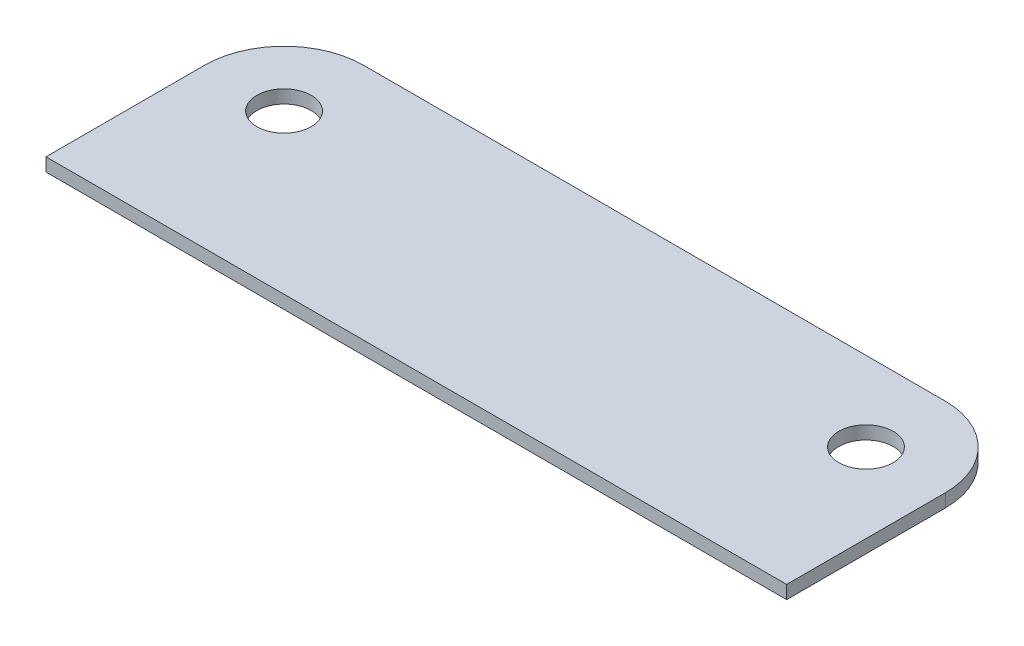
ISO-10303-21;
HEADER;
FILE_DESCRIPTION(('STEP AP214'),'2;1');
FILE_NAME('part.step','',(''),(''),'','','');
FILE_SCHEMA(('AUTOMOTIVE_DESIGN { 1 0 10303 214 1 1 1 1 }'));
ENDSEC;
DATA;
#1=APPLICATION_CONTEXT('core data for automotive mechanical design processes');
#2=APPLICATION_PROTOCOL_DEFINITION('international standard','automotive_design',2000,#1);
#3=PRODUCT_CONTEXT('',#1,'mechanical');
#4=PRODUCT('Part','Part','',(#3));
#5=PRODUCT_RELATED_PRODUCT_CATEGORY('part','',(#4));
#6=PRODUCT_DEFINITION_FORMATION('','',#4);
#7=PRODUCT_DEFINITION_CONTEXT('part definition',#1,'design');
#8=PRODUCT_DEFINITION('design','',#6,#7);
#9=PRODUCT_DEFINITION_SHAPE('','',#8);
#10=(LENGTH_UNIT() NAMED_UNIT(*) SI_UNIT(.MILLI.,.METRE.));
#11=(NAMED_UNIT(*) PLANE_ANGLE_UNIT() SI_UNIT($,.RADIAN.));
#12=(NAMED_UNIT(*) SI_UNIT($,.STERADIAN.) SOLID_ANGLE_UNIT());
#13=UNCERTAINTY_MEASURE_WITH_UNIT(LENGTH_MEASURE(1.E-05),#10,'distance_accuracy_value','');
#14=(GEOMETRIC_REPRESENTATION_CONTEXT(3) GLOBAL_UNCERTAINTY_ASSIGNED_CONTEXT((#13)) GLOBAL_UNIT_ASSIGNED_CONTEXT((#10,
#11,#12)) REPRESENTATION_CONTEXT('',''));
#15=CARTESIAN_POINT('',(0.,0.,0.));
#16=DIRECTION('',(0.,0.,1.));
#17=DIRECTION('',(1.,0.,0.));
#18=AXIS2_PLACEMENT_3D('',#15,#16,#17);
#19=CARTESIAN_POINT('',(34.925,1.5875,-19.05));
#20=DIRECTION('',(0.,1.,0.));
#21=DIRECTION('',(0.,0.,1.));
#22=AXIS2_PLACEMENT_3D('',#19,#20,#21);
#23=PLANE('',#22);
#24=CARTESIAN_POINT('',(-34.925,1.5875,-19.05));
#25=DIRECTION('',(0.,1.,0.));
#26=DIRECTION('',(0.,0.,1.));
#27=AXIS2_PLACEMENT_3D('',#24,#25,#26);
#28=CIRCLE('',#27,3.26390000000007);
#29=CARTESIAN_POINT('',(-34.925,1.5875,-15.7860999999999));
#30=VERTEX_POINT('',#29);
#31=EDGE_CURVE('E128',#30,#30,#28,.T.);
#32=ORIENTED_EDGE('',*,*,#31,.F.);
#33=EDGE_LOOP('',(#32));
#34=FACE_BOUND('',#33,.T.);
#35=DIRECTION('',(0.,0.,-1.));
#36=VECTOR('',#35,1.);
#37=CARTESIAN_POINT('',(44.45,1.5875,0.));
#38=LINE('',#37,#36);
#39=CARTESIAN_POINT('',(44.45,1.5875,0.));
#40=VERTEX_POINT('',#39);
#41=CARTESIAN_POINT('',(44.45,1.5875,-19.05));
#42=VERTEX_POINT('',#41);
#43=EDGE_CURVE('E135',#40,#42,#38,.T.);
#44=ORIENTED_EDGE('',*,*,#43,.T.);
#45=CARTESIAN_POINT('',(34.925,1.5875,-19.05));
#46=DIRECTION('',(0.,1.,0.));
#47=DIRECTION('',(0.,0.,1.));
#48=AXIS2_PLACEMENT_3D('',#45,#46,#47);
#49=CIRCLE('',#48,9.525);
#50=CARTESIAN_POINT('',(34.925,1.5875,-28.575));
#51=VERTEX_POINT('',#50);
#52=EDGE_CURVE('E93',#42,#51,#49,.T.);
#53=ORIENTED_EDGE('',*,*,#52,.T.);
#54=DIRECTION('',(-1.,0.,0.));
#55=VECTOR('',#54,1.);
#56=CARTESIAN_POINT('',(-34.925,1.5875,-28.575));
#57=LINE('',#56,#55);
#58=CARTESIAN_POINT('',(-34.925,1.5875,-28.575));
#59=VERTEX_POINT('',#58);
#60=EDGE_CURVE('E106',#51,#59,#57,.T.);
#61=ORIENTED_EDGE('',*,*,#60,.T.);
#62=CARTESIAN_POINT('',(-34.925,1.5875,-19.05));
#63=DIRECTION('',(0.,1.,0.));
#64=DIRECTION('',(0.,0.,1.));
#65=AXIS2_PLACEMENT_3D('',#62,#63,#64);
#66=CIRCLE('',#65,9.525);
#67=CARTESIAN_POINT('',(-44.45,1.5875,-19.05));
#68=VERTEX_POINT('',#67);
#69=EDGE_CURVE('E100',#59,#68,#66,.T.);
#70=ORIENTED_EDGE('',*,*,#69,.T.);
#71=DIRECTION('',(0.,0.,1.));
#72=VECTOR('',#71,1.);
#73=CARTESIAN_POINT('',(-44.45,1.5875,-19.05));
#74=LINE('',#73,#72);
#75=CARTESIAN_POINT('',(-44.45,1.5875,0.));
#76=VERTEX_POINT('',#75);
#77=EDGE_CURVE('E104',#68,#76,#74,.T.);
#78=ORIENTED_EDGE('',*,*,#77,.T.);
#79=DIRECTION('',(1.,0.,0.));
#80=VECTOR('',#79,1.);
#81=CARTESIAN_POINT('',(-44.45,1.5875,0.));
#82=LINE('',#81,#80);
#83=EDGE_CURVE('E56',#76,#40,#82,.T.);
#84=ORIENTED_EDGE('',*,*,#83,.T.);
#85=EDGE_LOOP('',(#44,#53,#61,#70,#78,#84));
#86=FACE_BOUND('',#85,.T.);
#87=CARTESIAN_POINT('',(34.925,1.5875,-19.05));
#88=DIRECTION('',(0.,1.,0.));
#89=DIRECTION('',(0.,0.,1.));
#90=AXIS2_PLACEMENT_3D('',#87,#88,#89);
#91=CIRCLE('',#90,3.26390000000003);
#92=CARTESIAN_POINT('',(34.925,1.5875,-15.7861));
#93=VERTEX_POINT('',#92);
#94=EDGE_CURVE('E177',#93,#93,#91,.T.);
#95=ORIENTED_EDGE('',*,*,#94,.F.);
#96=EDGE_LOOP('',(#95));
#97=FACE_BOUND('',#96,.T.);
#98=ADVANCED_FACE('F39',(#34,#86,#97),#23,.T.);
#99=CARTESIAN_POINT('',(34.925,0.,-19.05));
#100=DIRECTION('',(0.,1.,0.));
#101=DIRECTION('',(0.,0.,1.));
#102=AXIS2_PLACEMENT_3D('',#99,#100,#101);
#103=PLANE('',#102);
#104=DIRECTION('',(0.,0.,-1.));
#105=VECTOR('',#104,1.);
#106=CARTESIAN_POINT('',(44.45,0.,0.));
#107=LINE('',#106,#105);
#108=CARTESIAN_POINT('',(44.45,0.,0.));
#109=VERTEX_POINT('',#108);
#110=CARTESIAN_POINT('',(44.45,0.,-19.05));
#111=VERTEX_POINT('',#110);
#112=EDGE_CURVE('E124',#109,#111,#107,.T.);
#113=ORIENTED_EDGE('',*,*,#112,.F.);
#114=DIRECTION('',(1.,0.,0.));
#115=VECTOR('',#114,1.);
#116=CARTESIAN_POINT('',(-44.45,0.,0.));
#117=LINE('',#116,#115);
#118=CARTESIAN_POINT('',(-44.45,0.,0.));
#119=VERTEX_POINT('',#118);
#120=EDGE_CURVE('E85',#119,#109,#117,.T.);
#121=ORIENTED_EDGE('',*,*,#120,.F.);
#122=DIRECTION('',(0.,0.,1.));
#123=VECTOR('',#122,1.);
#124=CARTESIAN_POINT('',(-44.45,0.,-19.05));
#125=LINE('',#124,#123);
#126=CARTESIAN_POINT('',(-44.45,0.,-19.05));
#127=VERTEX_POINT('',#126);
#128=EDGE_CURVE('E79',#127,#119,#125,.T.);
#129=ORIENTED_EDGE('',*,*,#128,.F.);
#130=CARTESIAN_POINT('',(-34.925,0.,-19.05));
#131=DIRECTION('',(0.,1.,0.));
#132=DIRECTION('',(0.,0.,1.));
#133=AXIS2_PLACEMENT_3D('',#130,#131,#132);
#134=CIRCLE('',#133,9.525);
#135=CARTESIAN_POINT('',(-34.925,0.,-28.575));
#136=VERTEX_POINT('',#135);
#137=EDGE_CURVE('E114',#136,#127,#134,.T.);
#138=ORIENTED_EDGE('',*,*,#137,.F.);
#139=DIRECTION('',(-1.,0.,0.));
#140=VECTOR('',#139,1.);
#141=CARTESIAN_POINT('',(-34.925,0.,-28.575));
#142=LINE('',#141,#140);
#143=CARTESIAN_POINT('',(34.925,0.,-28.575));
#144=VERTEX_POINT('',#143);
#145=EDGE_CURVE('E130',#144,#136,#142,.T.);
#146=ORIENTED_EDGE('',*,*,#145,.F.);
#147=CARTESIAN_POINT('',(34.925,0.,-19.05));
#148=DIRECTION('',(0.,1.,0.));
#149=DIRECTION('',(0.,0.,1.));
#150=AXIS2_PLACEMENT_3D('',#147,#148,#149);
#151=CIRCLE('',#150,9.525);
#152=EDGE_CURVE('E127',#111,#144,#151,.T.);
#153=ORIENTED_EDGE('',*,*,#152,.F.);
#154=EDGE_LOOP('',(#113,#121,#129,#138,#146,#153));
#155=FACE_BOUND('',#154,.T.);
#156=CARTESIAN_POINT('',(-34.925,0.,-19.05));
#157=DIRECTION('',(0.,1.,0.));
#158=DIRECTION('',(0.,0.,1.));
#159=AXIS2_PLACEMENT_3D('',#156,#157,#158);
#160=CIRCLE('',#159,3.26390000000007);
#161=CARTESIAN_POINT('',(-34.925,0.,-15.7860999999999));
#162=VERTEX_POINT('',#161);
#163=EDGE_CURVE('E183',#162,#162,#160,.T.);
#164=ORIENTED_EDGE('',*,*,#163,.T.);
#165=EDGE_LOOP('',(#164));
#166=FACE_BOUND('',#165,.T.);
#167=CARTESIAN_POINT('',(34.925,0.,-19.05));
#168=DIRECTION('',(0.,1.,0.));
#169=DIRECTION('',(0.,0.,1.));
#170=AXIS2_PLACEMENT_3D('',#167,#168,#169);
#171=CIRCLE('',#170,3.26390000000003);
#172=CARTESIAN_POINT('',(34.925,0.,-15.7861));
#173=VERTEX_POINT('',#172);
#174=EDGE_CURVE('E180',#173,#173,#171,.T.);
#175=ORIENTED_EDGE('',*,*,#174,.T.);
#176=EDGE_LOOP('',(#175));
#177=FACE_BOUND('',#176,.T.);
#178=ADVANCED_FACE('F144',(#155,#166,#177),#103,.F.);
#179=CARTESIAN_POINT('',(44.45,1.5875,0.));
#180=DIRECTION('',(-1.,0.,0.));
#181=DIRECTION('',(0.,0.,1.));
#182=AXIS2_PLACEMENT_3D('',#179,#180,#181);
#183=PLANE('',#182);
#184=ORIENTED_EDGE('',*,*,#112,.T.);
#185=DIRECTION('',(0.,-1.,0.));
#186=VECTOR('',#185,1.);
#187=CARTESIAN_POINT('',(44.45,1.5875,-19.05));
#188=LINE('',#187,#186);
#189=EDGE_CURVE('E11',#42,#111,#188,.T.);
#190=ORIENTED_EDGE('',*,*,#189,.F.);
#191=ORIENTED_EDGE('',*,*,#43,.F.);
#192=DIRECTION('',(0.,-1.,0.));
#193=VECTOR('',#192,1.);
#194=CARTESIAN_POINT('',(44.45,1.5875,0.));
#195=LINE('',#194,#193);
#196=EDGE_CURVE('E120',#40,#109,#195,.T.);
#197=ORIENTED_EDGE('',*,*,#196,.T.);
#198=EDGE_LOOP('',(#184,#190,#191,#197));
#199=FACE_BOUND('',#198,.T.);
#200=ADVANCED_FACE('F41',(#199),#183,.F.);
#201=CARTESIAN_POINT('',(34.925,1.5875,-19.05));
#202=DIRECTION('',(0.,-1.,0.));
#203=DIRECTION('',(0.,0.,-1.));
#204=AXIS2_PLACEMENT_3D('',#201,#202,#203);
#205=CYLINDRICAL_SURFACE('',#204,9.525);
#206=ORIENTED_EDGE('',*,*,#152,.T.);
#207=DIRECTION('',(0.,-1.,0.));
#208=VECTOR('',#207,1.);
#209=CARTESIAN_POINT('',(34.925,1.5875,-28.575));
#210=LINE('',#209,#208);
#211=EDGE_CURVE('E48',#51,#144,#210,.T.);
#212=ORIENTED_EDGE('',*,*,#211,.F.);
#213=ORIENTED_EDGE('',*,*,#52,.F.);
#214=ORIENTED_EDGE('',*,*,#189,.T.);
#215=EDGE_LOOP('',(#206,#212,#213,#214));
#216=FACE_BOUND('',#215,.T.);
#217=ADVANCED_FACE('F226',(#216),#205,.T.);
#218=CARTESIAN_POINT('',(-34.925,1.5875,-28.575));
#219=DIRECTION('',(0.,0.,1.));
#220=DIRECTION('',(1.,0.,0.));
#221=AXIS2_PLACEMENT_3D('',#218,#219,#220);
#222=PLANE('',#221);
#223=ORIENTED_EDGE('',*,*,#145,.T.);
#224=DIRECTION('',(0.,-1.,0.));
#225=VECTOR('',#224,1.);
#226=CARTESIAN_POINT('',(-34.925,1.5875,-28.575));
#227=LINE('',#226,#225);
#228=EDGE_CURVE('E115',#59,#136,#227,.T.);
#229=ORIENTED_EDGE('',*,*,#228,.F.);
#230=ORIENTED_EDGE('',*,*,#60,.F.);
#231=ORIENTED_EDGE('',*,*,#211,.T.);
#232=EDGE_LOOP('',(#223,#229,#230,#231));
#233=FACE_BOUND('',#232,.T.);
#234=ADVANCED_FACE('F141',(#233),#222,.F.);
#235=CARTESIAN_POINT('',(-34.925,1.5875,-19.05));
#236=DIRECTION('',(0.,-1.,0.));
#237=DIRECTION('',(0.,0.,-1.));
#238=AXIS2_PLACEMENT_3D('',#235,#236,#237);
#239=CYLINDRICAL_SURFACE('',#238,9.525);
#240=ORIENTED_EDGE('',*,*,#137,.T.);
#241=DIRECTION('',(0.,-1.,0.));
#242=VECTOR('',#241,1.);
#243=CARTESIAN_POINT('',(-44.45,1.5875,-19.05));
#244=LINE('',#243,#242);
#245=EDGE_CURVE('E111',#68,#127,#244,.T.);
#246=ORIENTED_EDGE('',*,*,#245,.F.);
#247=ORIENTED_EDGE('',*,*,#69,.F.);
#248=ORIENTED_EDGE('',*,*,#228,.T.);
#249=EDGE_LOOP('',(#240,#246,#247,#248));
#250=FACE_BOUND('',#249,.T.);
#251=ADVANCED_FACE('F112',(#250),#239,.T.);
#252=CARTESIAN_POINT('',(-44.45,1.5875,-19.05));
#253=DIRECTION('',(1.,0.,0.));
#254=DIRECTION('',(0.,0.,-1.));
#255=AXIS2_PLACEMENT_3D('',#252,#253,#254);
#256=PLANE('',#255);
#257=ORIENTED_EDGE('',*,*,#128,.T.);
#258=DIRECTION('',(0.,-1.,0.));
#259=VECTOR('',#258,1.);
#260=CARTESIAN_POINT('',(-44.45,1.5875,0.));
#261=LINE('',#260,#259);
#262=EDGE_CURVE('E116',#76,#119,#261,.T.);
#263=ORIENTED_EDGE('',*,*,#262,.F.);
#264=ORIENTED_EDGE('',*,*,#77,.F.);
#265=ORIENTED_EDGE('',*,*,#245,.T.);
#266=EDGE_LOOP('',(#257,#263,#264,#265));
#267=FACE_BOUND('',#266,.T.);
#268=ADVANCED_FACE('F118',(#267),#256,.F.);
#269=CARTESIAN_POINT('',(-44.45,1.5875,0.));
#270=DIRECTION('',(0.,0.,-1.));
#271=DIRECTION('',(-1.,0.,0.));
#272=AXIS2_PLACEMENT_3D('',#269,#270,#271);
#273=PLANE('',#272);
#274=ORIENTED_EDGE('',*,*,#120,.T.);
#275=ORIENTED_EDGE('',*,*,#196,.F.);
#276=ORIENTED_EDGE('',*,*,#83,.F.);
#277=ORIENTED_EDGE('',*,*,#262,.T.);
#278=EDGE_LOOP('',(#274,#275,#276,#277));
#279=FACE_BOUND('',#278,.T.);
#280=ADVANCED_FACE('F149',(#279),#273,.F.);
#281=CARTESIAN_POINT('',(-34.925,1.5875,-19.05));
#282=DIRECTION('',(0.,-1.,0.));
#283=DIRECTION('',(0.,0.,-1.));
#284=AXIS2_PLACEMENT_3D('',#281,#282,#283);
#285=CYLINDRICAL_SURFACE('',#284,3.26390000000007);
#286=ORIENTED_EDGE('',*,*,#31,.T.);
#287=EDGE_LOOP('',(#286));
#288=FACE_BOUND('',#287,.T.);
#289=ORIENTED_EDGE('',*,*,#163,.F.);
#290=EDGE_LOOP('',(#289));
#291=FACE_BOUND('',#290,.T.);
#292=ADVANCED_FACE('F151',(#288,#291),#285,.F.);
#293=CARTESIAN_POINT('',(34.925,1.5875,-19.05));
#294=DIRECTION('',(0.,-1.,0.));
#295=DIRECTION('',(0.,0.,-1.));
#296=AXIS2_PLACEMENT_3D('',#293,#294,#295);
#297=CYLINDRICAL_SURFACE('',#296,3.26390000000003);
#298=ORIENTED_EDGE('',*,*,#94,.T.);
#299=EDGE_LOOP('',(#298));
#300=FACE_BOUND('',#299,.T.);
#301=ORIENTED_EDGE('',*,*,#174,.F.);
#302=EDGE_LOOP('',(#301));
#303=FACE_BOUND('',#302,.T.);
#304=ADVANCED_FACE('F157',(#300,#303),#297,.F.);
#305=CLOSED_SHELL('',(#98,#178,#200,#217,#234,#251,#268,#280,#292,#304));
#306=MANIFOLD_SOLID_BREP('B2',#305);
#307=ADVANCED_BREP_SHAPE_REPRESENTATION('',(#18,#306),#14);
#308=SHAPE_DEFINITION_REPRESENTATION(#9,#307);
ENDSEC;
END-ISO-10303-21;
